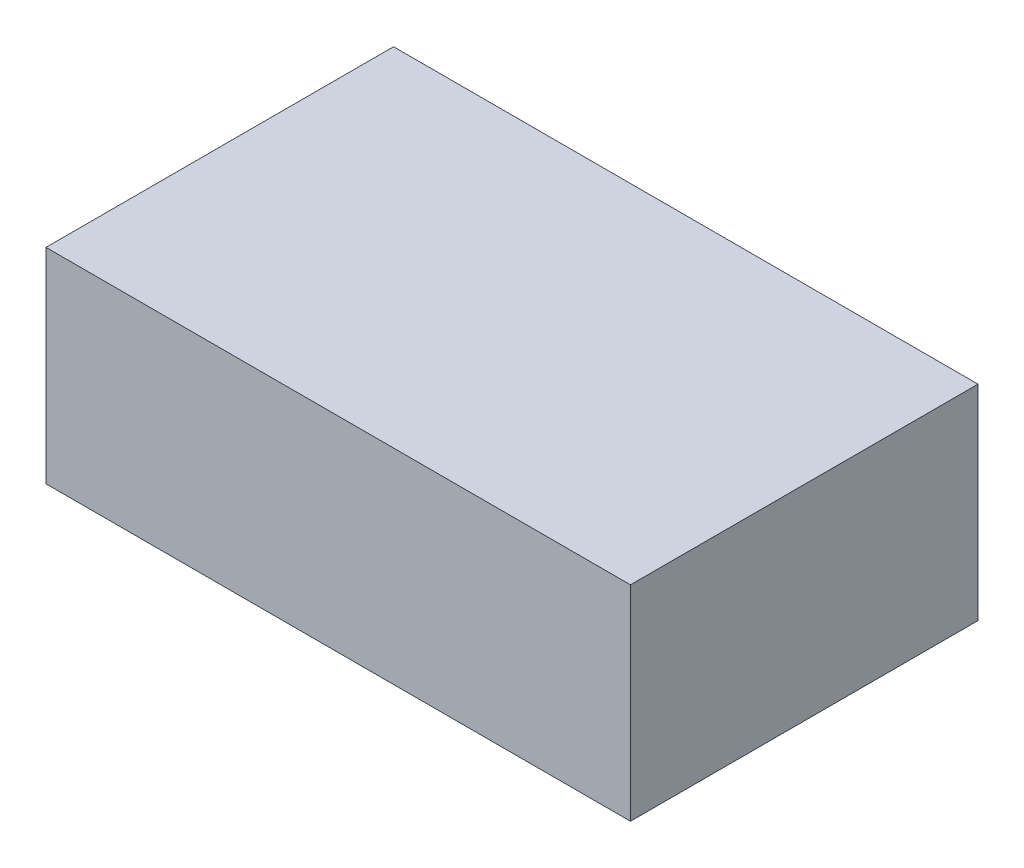
ISO-10303-21;
HEADER;
FILE_DESCRIPTION(('STEP AP214'),'2;1');
FILE_NAME('part.step','',(''),(''),'','','');
FILE_SCHEMA(('AUTOMOTIVE_DESIGN { 1 0 10303 214 1 1 1 1 }'));
ENDSEC;
DATA;
#1=APPLICATION_CONTEXT('core data for automotive mechanical design processes');
#2=APPLICATION_PROTOCOL_DEFINITION('international standard','automotive_design',2000,#1);
#3=PRODUCT_CONTEXT('',#1,'mechanical');
#4=PRODUCT('Part','Part','',(#3));
#5=PRODUCT_RELATED_PRODUCT_CATEGORY('part','',(#4));
#6=PRODUCT_DEFINITION_FORMATION('','',#4);
#7=PRODUCT_DEFINITION_CONTEXT('part definition',#1,'design');
#8=PRODUCT_DEFINITION('design','',#6,#7);
#9=PRODUCT_DEFINITION_SHAPE('','',#8);
#10=(LENGTH_UNIT() NAMED_UNIT(*) SI_UNIT(.MILLI.,.METRE.));
#11=(NAMED_UNIT(*) PLANE_ANGLE_UNIT() SI_UNIT($,.RADIAN.));
#12=(NAMED_UNIT(*) SI_UNIT($,.STERADIAN.) SOLID_ANGLE_UNIT());
#13=UNCERTAINTY_MEASURE_WITH_UNIT(LENGTH_MEASURE(1.E-05),#10,'distance_accuracy_value','');
#14=(GEOMETRIC_REPRESENTATION_CONTEXT(3) GLOBAL_UNCERTAINTY_ASSIGNED_CONTEXT((#13)) GLOBAL_UNIT_ASSIGNED_CONTEXT((#10,
#11,#12)) REPRESENTATION_CONTEXT('',''));
#15=CARTESIAN_POINT('',(0.,0.,0.));
#16=DIRECTION('',(0.,0.,1.));
#17=DIRECTION('',(1.,0.,0.));
#18=AXIS2_PLACEMENT_3D('',#15,#16,#17);
#19=CARTESIAN_POINT('',(-1.3699998,1.3699998,4.6500034));
#20=DIRECTION('',(1.,0.,0.));
#21=DIRECTION('',(0.,0.,-1.));
#22=AXIS2_PLACEMENT_3D('',#19,#20,#21);
#23=PLANE('',#22);
#24=DIRECTION('',(0.,-1.,0.));
#25=VECTOR('',#24,1.);
#26=CARTESIAN_POINT('',(-1.3699998,1.3699998,0.));
#27=LINE('',#26,#25);
#28=CARTESIAN_POINT('',(-1.3699998,1.3699998,0.));
#29=VERTEX_POINT('',#28);
#30=CARTESIAN_POINT('',(-1.3699998,-1.3699998,0.));
#31=VERTEX_POINT('',#30);
#32=EDGE_CURVE('E95',#29,#31,#27,.T.);
#33=ORIENTED_EDGE('',*,*,#32,.T.);
#34=DIRECTION('',(0.,0.,-1.));
#35=VECTOR('',#34,1.);
#36=CARTESIAN_POINT('',(-1.3699998,-1.3699998,4.6500034));
#37=LINE('',#36,#35);
#38=CARTESIAN_POINT('',(-1.3699998,-1.3699998,4.6500034));
#39=VERTEX_POINT('',#38);
#40=EDGE_CURVE('E11',#39,#31,#37,.T.);
#41=ORIENTED_EDGE('',*,*,#40,.F.);
#42=DIRECTION('',(0.,-1.,0.));
#43=VECTOR('',#42,1.);
#44=CARTESIAN_POINT('',(-1.3699998,1.3699998,4.6500034));
#45=LINE('',#44,#43);
#46=CARTESIAN_POINT('',(-1.3699998,1.3699998,4.6500034));
#47=VERTEX_POINT('',#46);
#48=EDGE_CURVE('E83',#47,#39,#45,.T.);
#49=ORIENTED_EDGE('',*,*,#48,.F.);
#50=DIRECTION('',(0.,0.,-1.));
#51=VECTOR('',#50,1.);
#52=CARTESIAN_POINT('',(-1.3699998,1.3699998,4.6500034));
#53=LINE('',#52,#51);
#54=EDGE_CURVE('E91',#47,#29,#53,.T.);
#55=ORIENTED_EDGE('',*,*,#54,.T.);
#56=EDGE_LOOP('',(#33,#41,#49,#55));
#57=FACE_BOUND('',#56,.T.);
#58=ADVANCED_FACE('F32',(#57),#23,.F.);
#59=CARTESIAN_POINT('',(-1.3699998,-1.3699998,4.6500034));
#60=DIRECTION('',(0.,1.,0.));
#61=DIRECTION('',(0.,0.,1.));
#62=AXIS2_PLACEMENT_3D('',#59,#60,#61);
#63=PLANE('',#62);
#64=DIRECTION('',(1.,0.,0.));
#65=VECTOR('',#64,1.);
#66=CARTESIAN_POINT('',(-1.3699998,-1.3699998,0.));
#67=LINE('',#66,#65);
#68=CARTESIAN_POINT('',(6.4499998,-1.3699998,0.));
#69=VERTEX_POINT('',#68);
#70=EDGE_CURVE('E87',#31,#69,#67,.T.);
#71=ORIENTED_EDGE('',*,*,#70,.T.);
#72=DIRECTION('',(0.,0.,-1.));
#73=VECTOR('',#72,1.);
#74=CARTESIAN_POINT('',(6.4499998,-1.3699998,4.6500034));
#75=LINE('',#74,#73);
#76=CARTESIAN_POINT('',(6.4499998,-1.3699998,4.6500034));
#77=VERTEX_POINT('',#76);
#78=EDGE_CURVE('E40',#77,#69,#75,.T.);
#79=ORIENTED_EDGE('',*,*,#78,.F.);
#80=DIRECTION('',(1.,0.,0.));
#81=VECTOR('',#80,1.);
#82=CARTESIAN_POINT('',(-1.3699998,-1.3699998,4.6500034));
#83=LINE('',#82,#81);
#84=EDGE_CURVE('E78',#39,#77,#83,.T.);
#85=ORIENTED_EDGE('',*,*,#84,.F.);
#86=ORIENTED_EDGE('',*,*,#40,.T.);
#87=EDGE_LOOP('',(#71,#79,#85,#86));
#88=FACE_BOUND('',#87,.T.);
#89=ADVANCED_FACE('F86',(#88),#63,.F.);
#90=CARTESIAN_POINT('',(6.4499998,-1.3699998,4.6500034));
#91=DIRECTION('',(-1.,0.,0.));
#92=DIRECTION('',(0.,0.,1.));
#93=AXIS2_PLACEMENT_3D('',#90,#91,#92);
#94=PLANE('',#93);
#95=DIRECTION('',(0.,1.,0.));
#96=VECTOR('',#95,1.);
#97=CARTESIAN_POINT('',(6.4499998,-1.3699998,0.));
#98=LINE('',#97,#96);
#99=CARTESIAN_POINT('',(6.4499998,1.3699998,0.));
#100=VERTEX_POINT('',#99);
#101=EDGE_CURVE('E65',#69,#100,#98,.T.);
#102=ORIENTED_EDGE('',*,*,#101,.T.);
#103=DIRECTION('',(0.,0.,-1.));
#104=VECTOR('',#103,1.);
#105=CARTESIAN_POINT('',(6.4499998,1.3699998,4.6500034));
#106=LINE('',#105,#104);
#107=CARTESIAN_POINT('',(6.4499998,1.3699998,4.6500034));
#108=VERTEX_POINT('',#107);
#109=EDGE_CURVE('E88',#108,#100,#106,.T.);
#110=ORIENTED_EDGE('',*,*,#109,.F.);
#111=DIRECTION('',(0.,1.,0.));
#112=VECTOR('',#111,1.);
#113=CARTESIAN_POINT('',(6.4499998,-1.3699998,4.6500034));
#114=LINE('',#113,#112);
#115=EDGE_CURVE('E81',#77,#108,#114,.T.);
#116=ORIENTED_EDGE('',*,*,#115,.F.);
#117=ORIENTED_EDGE('',*,*,#78,.T.);
#118=EDGE_LOOP('',(#102,#110,#116,#117));
#119=FACE_BOUND('',#118,.T.);
#120=ADVANCED_FACE('F89',(#119),#94,.F.);
#121=CARTESIAN_POINT('',(6.4499998,1.3699998,4.6500034));
#122=DIRECTION('',(0.,-1.,0.));
#123=DIRECTION('',(0.,0.,-1.));
#124=AXIS2_PLACEMENT_3D('',#121,#122,#123);
#125=PLANE('',#124);
#126=DIRECTION('',(-1.,0.,0.));
#127=VECTOR('',#126,1.);
#128=CARTESIAN_POINT('',(6.4499998,1.3699998,0.));
#129=LINE('',#128,#127);
#130=EDGE_CURVE('E71',#100,#29,#129,.T.);
#131=ORIENTED_EDGE('',*,*,#130,.T.);
#132=ORIENTED_EDGE('',*,*,#54,.F.);
#133=DIRECTION('',(-1.,0.,0.));
#134=VECTOR('',#133,1.);
#135=CARTESIAN_POINT('',(6.4499998,1.3699998,4.6500034));
#136=LINE('',#135,#134);
#137=EDGE_CURVE('E48',#108,#47,#136,.T.);
#138=ORIENTED_EDGE('',*,*,#137,.F.);
#139=ORIENTED_EDGE('',*,*,#109,.T.);
#140=EDGE_LOOP('',(#131,#132,#138,#139));
#141=FACE_BOUND('',#140,.T.);
#142=ADVANCED_FACE('F102',(#141),#125,.F.);
#143=CARTESIAN_POINT('',(0.,0.,4.6500034));
#144=DIRECTION('',(0.,0.,1.));
#145=DIRECTION('',(1.,0.,0.));
#146=AXIS2_PLACEMENT_3D('',#143,#144,#145);
#147=PLANE('',#146);
#148=ORIENTED_EDGE('',*,*,#48,.T.);
#149=ORIENTED_EDGE('',*,*,#84,.T.);
#150=ORIENTED_EDGE('',*,*,#115,.T.);
#151=ORIENTED_EDGE('',*,*,#137,.T.);
#152=EDGE_LOOP('',(#148,#149,#150,#151));
#153=FACE_BOUND('',#152,.T.);
#154=ADVANCED_FACE('F79',(#153),#147,.T.);
#155=CARTESIAN_POINT('',(0.,0.,0.));
#156=DIRECTION('',(0.,0.,1.));
#157=DIRECTION('',(1.,0.,0.));
#158=AXIS2_PLACEMENT_3D('',#155,#156,#157);
#159=PLANE('',#158);
#160=ORIENTED_EDGE('',*,*,#32,.F.);
#161=ORIENTED_EDGE('',*,*,#130,.F.);
#162=ORIENTED_EDGE('',*,*,#101,.F.);
#163=ORIENTED_EDGE('',*,*,#70,.F.);
#164=EDGE_LOOP('',(#160,#161,#162,#163));
#165=FACE_BOUND('',#164,.T.);
#166=ADVANCED_FACE('F105',(#165),#159,.F.);
#167=CLOSED_SHELL('',(#58,#89,#120,#142,#154,#166));
#168=MANIFOLD_SOLID_BREP('B2',#167);
#169=ADVANCED_BREP_SHAPE_REPRESENTATION('',(#18,#168),#14);
#170=SHAPE_DEFINITION_REPRESENTATION(#9,#169);
ENDSEC;
END-ISO-10303-21;
